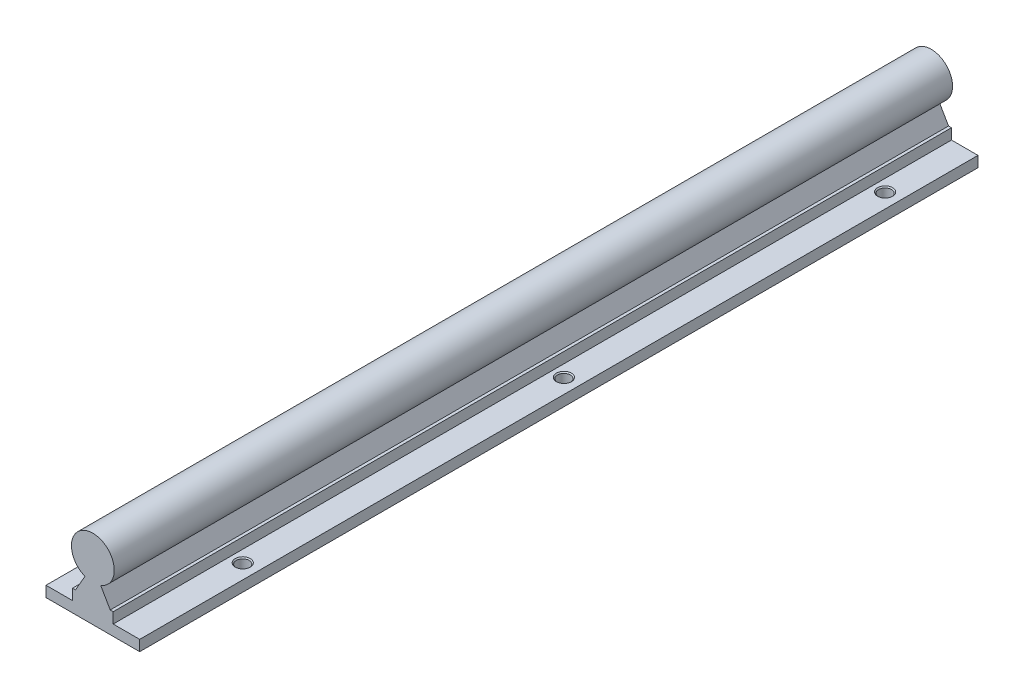
ISO-10303-21;
HEADER;
FILE_DESCRIPTION(('STEP AP214'),'2;1');
FILE_NAME('part.step','',(''),(''),'','','');
FILE_SCHEMA(('AUTOMOTIVE_DESIGN { 1 0 10303 214 1 1 1 1 }'));
ENDSEC;
DATA;
#1=APPLICATION_CONTEXT('core data for automotive mechanical design processes');
#2=APPLICATION_PROTOCOL_DEFINITION('international standard','automotive_design',2000,#1);
#3=PRODUCT_CONTEXT('',#1,'mechanical');
#4=PRODUCT('Part','Part','',(#3));
#5=PRODUCT_RELATED_PRODUCT_CATEGORY('part','',(#4));
#6=PRODUCT_DEFINITION_FORMATION('','',#4);
#7=PRODUCT_DEFINITION_CONTEXT('part definition',#1,'design');
#8=PRODUCT_DEFINITION('design','',#6,#7);
#9=PRODUCT_DEFINITION_SHAPE('','',#8);
#10=(LENGTH_UNIT() NAMED_UNIT(*) SI_UNIT(.MILLI.,.METRE.));
#11=(NAMED_UNIT(*) PLANE_ANGLE_UNIT() SI_UNIT($,.RADIAN.));
#12=(NAMED_UNIT(*) SI_UNIT($,.STERADIAN.) SOLID_ANGLE_UNIT());
#13=UNCERTAINTY_MEASURE_WITH_UNIT(LENGTH_MEASURE(1.E-05),#10,'distance_accuracy_value','');
#14=(GEOMETRIC_REPRESENTATION_CONTEXT(3) GLOBAL_UNCERTAINTY_ASSIGNED_CONTEXT((#13)) GLOBAL_UNIT_ASSIGNED_CONTEXT((#10,
#11,#12)) REPRESENTATION_CONTEXT('',''));
#15=CARTESIAN_POINT('',(0.,0.,0.));
#16=DIRECTION('',(0.,0.,1.));
#17=DIRECTION('',(1.,0.,0.));
#18=AXIS2_PLACEMENT_3D('',#15,#16,#17);
#19=CARTESIAN_POINT('',(-8.12119226265795,10.,205.));
#20=DIRECTION('',(0.,-1.,0.));
#21=DIRECTION('',(0.,0.,-1.));
#22=AXIS2_PLACEMENT_3D('',#19,#20,#21);
#23=PLANE('',#22);
#24=DIRECTION('',(0.,0.,-1.));
#25=VECTOR('',#24,1.);
#26=CARTESIAN_POINT('',(-8.12119226265795,10.,205.));
#27=LINE('',#26,#25);
#28=CARTESIAN_POINT('',(-8.12119226265795,10.,205.));
#29=VERTEX_POINT('',#28);
#30=CARTESIAN_POINT('',(-8.12119226265795,10.,-186.5));
#31=VERTEX_POINT('',#30);
#32=EDGE_CURVE('E316',#29,#31,#27,.T.);
#33=ORIENTED_EDGE('',*,*,#32,.T.);
#34=DIRECTION('',(-1.,0.,0.));
#35=VECTOR('',#34,1.);
#36=CARTESIAN_POINT('',(-8.12119226265795,10.,-186.5));
#37=LINE('',#36,#35);
#38=CARTESIAN_POINT('',(-9.5,10.,-186.5));
#39=VERTEX_POINT('',#38);
#40=EDGE_CURVE('E56',#31,#39,#37,.T.);
#41=ORIENTED_EDGE('',*,*,#40,.T.);
#42=DIRECTION('',(0.,0.,-1.));
#43=VECTOR('',#42,1.);
#44=CARTESIAN_POINT('',(-9.5,10.,205.));
#45=LINE('',#44,#43);
#46=CARTESIAN_POINT('',(-9.5,10.,205.));
#47=VERTEX_POINT('',#46);
#48=EDGE_CURVE('E167',#47,#39,#45,.T.);
#49=ORIENTED_EDGE('',*,*,#48,.F.);
#50=DIRECTION('',(-1.,0.,0.));
#51=VECTOR('',#50,1.);
#52=CARTESIAN_POINT('',(-8.12119226265795,10.,205.));
#53=LINE('',#52,#51);
#54=EDGE_CURVE('E293',#29,#47,#53,.T.);
#55=ORIENTED_EDGE('',*,*,#54,.F.);
#56=EDGE_LOOP('',(#33,#41,#49,#55));
#57=FACE_BOUND('',#56,.T.);
#58=ADVANCED_FACE('F40',(#57),#23,.F.);
#59=CARTESIAN_POINT('',(-9.5,10.,205.));
#60=DIRECTION('',(1.,0.,0.));
#61=DIRECTION('',(0.,1.,0.));
#62=AXIS2_PLACEMENT_3D('',#59,#60,#61);
#63=PLANE('',#62);
#64=ORIENTED_EDGE('',*,*,#48,.T.);
#65=DIRECTION('',(0.,-1.,0.));
#66=VECTOR('',#65,1.);
#67=CARTESIAN_POINT('',(-9.5,10.,-186.5));
#68=LINE('',#67,#66);
#69=CARTESIAN_POINT('',(-9.5,5.,-186.5));
#70=VERTEX_POINT('',#69);
#71=EDGE_CURVE('E340',#39,#70,#68,.T.);
#72=ORIENTED_EDGE('',*,*,#71,.T.);
#73=DIRECTION('',(0.,0.,-1.));
#74=VECTOR('',#73,1.);
#75=CARTESIAN_POINT('',(-9.5,5.,205.));
#76=LINE('',#75,#74);
#77=CARTESIAN_POINT('',(-9.5,5.,205.));
#78=VERTEX_POINT('',#77);
#79=EDGE_CURVE('E164',#78,#70,#76,.T.);
#80=ORIENTED_EDGE('',*,*,#79,.F.);
#81=DIRECTION('',(0.,-1.,0.));
#82=VECTOR('',#81,1.);
#83=CARTESIAN_POINT('',(-9.5,10.,205.));
#84=LINE('',#83,#82);
#85=EDGE_CURVE('E296',#47,#78,#84,.T.);
#86=ORIENTED_EDGE('',*,*,#85,.F.);
#87=EDGE_LOOP('',(#64,#72,#80,#86));
#88=FACE_BOUND('',#87,.T.);
#89=ADVANCED_FACE('F220',(#88),#63,.F.);
#90=CARTESIAN_POINT('',(-9.5,5.,205.));
#91=DIRECTION('',(0.,-1.,0.));
#92=DIRECTION('',(1.,0.,0.));
#93=AXIS2_PLACEMENT_3D('',#90,#91,#92);
#94=PLANE('',#93);
#95=CARTESIAN_POINT('',(-15.,5.,150.));
#96=DIRECTION('',(0.,-1.,0.));
#97=DIRECTION('',(1.,0.,0.));
#98=AXIS2_PLACEMENT_3D('',#95,#96,#97);
#99=CIRCLE('',#98,3.50000000000056);
#100=CARTESIAN_POINT('',(-11.4999999999994,5.,150.));
#101=VERTEX_POINT('',#100);
#102=EDGE_CURVE('E179',#101,#101,#99,.T.);
#103=ORIENTED_EDGE('',*,*,#102,.T.);
#104=EDGE_LOOP('',(#103));
#105=FACE_BOUND('',#104,.T.);
#106=CARTESIAN_POINT('',(-15.,5.,0.));
#107=DIRECTION('',(0.,-1.,0.));
#108=DIRECTION('',(1.,0.,0.));
#109=AXIS2_PLACEMENT_3D('',#106,#107,#108);
#110=CIRCLE('',#109,3.50000000000056);
#111=CARTESIAN_POINT('',(-11.4999999999994,5.,0.));
#112=VERTEX_POINT('',#111);
#113=EDGE_CURVE('E176',#112,#112,#110,.T.);
#114=ORIENTED_EDGE('',*,*,#113,.T.);
#115=EDGE_LOOP('',(#114));
#116=FACE_BOUND('',#115,.T.);
#117=CARTESIAN_POINT('',(-15.,5.,-150.));
#118=DIRECTION('',(0.,-1.,0.));
#119=DIRECTION('',(1.,0.,0.));
#120=AXIS2_PLACEMENT_3D('',#117,#118,#119);
#121=CIRCLE('',#120,3.50000000000001);
#122=CARTESIAN_POINT('',(-11.4999999999999,5.,-150.));
#123=VERTEX_POINT('',#122);
#124=EDGE_CURVE('E173',#123,#123,#121,.T.);
#125=ORIENTED_EDGE('',*,*,#124,.T.);
#126=EDGE_LOOP('',(#125));
#127=FACE_BOUND('',#126,.T.);
#128=ORIENTED_EDGE('',*,*,#79,.T.);
#129=DIRECTION('',(-1.,0.,0.));
#130=VECTOR('',#129,1.);
#131=CARTESIAN_POINT('',(-9.5,5.,-186.5));
#132=LINE('',#131,#130);
#133=CARTESIAN_POINT('',(-21.88,5.,-186.5));
#134=VERTEX_POINT('',#133);
#135=EDGE_CURVE('E286',#70,#134,#132,.T.);
#136=ORIENTED_EDGE('',*,*,#135,.T.);
#137=DIRECTION('',(0.,0.,-1.));
#138=VECTOR('',#137,1.);
#139=CARTESIAN_POINT('',(-21.88,5.,205.));
#140=LINE('',#139,#138);
#141=CARTESIAN_POINT('',(-21.88,5.,205.));
#142=VERTEX_POINT('',#141);
#143=EDGE_CURVE('E156',#142,#134,#140,.T.);
#144=ORIENTED_EDGE('',*,*,#143,.F.);
#145=DIRECTION('',(-1.,0.,0.));
#146=VECTOR('',#145,1.);
#147=CARTESIAN_POINT('',(-9.5,5.,205.));
#148=LINE('',#147,#146);
#149=EDGE_CURVE('E298',#78,#142,#148,.T.);
#150=ORIENTED_EDGE('',*,*,#149,.F.);
#151=EDGE_LOOP('',(#128,#136,#144,#150));
#152=FACE_BOUND('',#151,.T.);
#153=ADVANCED_FACE('F226',(#105,#116,#127,#152),#94,.F.);
#154=CARTESIAN_POINT('',(-21.88,5.,205.));
#155=DIRECTION('',(1.,0.,0.));
#156=DIRECTION('',(0.,0.,-1.));
#157=AXIS2_PLACEMENT_3D('',#154,#155,#156);
#158=PLANE('',#157);
#159=ORIENTED_EDGE('',*,*,#143,.T.);
#160=DIRECTION('',(0.,-1.,0.));
#161=VECTOR('',#160,1.);
#162=CARTESIAN_POINT('',(-21.88,37.,-186.5));
#163=LINE('',#162,#161);
#164=CARTESIAN_POINT('',(-21.88,0.,-186.5));
#165=VERTEX_POINT('',#164);
#166=EDGE_CURVE('E140',#134,#165,#163,.T.);
#167=ORIENTED_EDGE('',*,*,#166,.T.);
#168=DIRECTION('',(0.,0.,-1.));
#169=VECTOR('',#168,1.);
#170=CARTESIAN_POINT('',(-21.88,0.,205.));
#171=LINE('',#170,#169);
#172=CARTESIAN_POINT('',(-21.88,0.,205.));
#173=VERTEX_POINT('',#172);
#174=EDGE_CURVE('E150',#173,#165,#171,.T.);
#175=ORIENTED_EDGE('',*,*,#174,.F.);
#176=DIRECTION('',(0.,-1.,0.));
#177=VECTOR('',#176,1.);
#178=CARTESIAN_POINT('',(-21.88,5.,205.));
#179=LINE('',#178,#177);
#180=EDGE_CURVE('E300',#142,#173,#179,.T.);
#181=ORIENTED_EDGE('',*,*,#180,.F.);
#182=EDGE_LOOP('',(#159,#167,#175,#181));
#183=FACE_BOUND('',#182,.T.);
#184=ADVANCED_FACE('F358',(#183),#158,.F.);
#185=CARTESIAN_POINT('',(-21.88,0.,205.));
#186=DIRECTION('',(0.,1.,0.));
#187=DIRECTION('',(0.,0.,1.));
#188=AXIS2_PLACEMENT_3D('',#185,#186,#187);
#189=PLANE('',#188);
#190=CARTESIAN_POINT('',(-15.,0.,150.));
#191=DIRECTION('',(0.,-1.,0.));
#192=DIRECTION('',(0.,0.,-1.));
#193=AXIS2_PLACEMENT_3D('',#190,#191,#192);
#194=CIRCLE('',#193,3.00000000000053);
#195=CARTESIAN_POINT('',(-15.,0.,146.999999999999));
#196=VERTEX_POINT('',#195);
#197=EDGE_CURVE('E294',#196,#196,#194,.T.);
#198=ORIENTED_EDGE('',*,*,#197,.F.);
#199=EDGE_LOOP('',(#198));
#200=FACE_BOUND('',#199,.T.);
#201=CARTESIAN_POINT('',(-15.,0.,0.));
#202=DIRECTION('',(0.,-1.,0.));
#203=DIRECTION('',(0.,0.,-1.));
#204=AXIS2_PLACEMENT_3D('',#201,#202,#203);
#205=CIRCLE('',#204,3.00000000000053);
#206=CARTESIAN_POINT('',(-15.,0.,-3.00000000000053));
#207=VERTEX_POINT('',#206);
#208=EDGE_CURVE('E283',#207,#207,#205,.T.);
#209=ORIENTED_EDGE('',*,*,#208,.F.);
#210=EDGE_LOOP('',(#209));
#211=FACE_BOUND('',#210,.T.);
#212=CARTESIAN_POINT('',(15.,0.,0.));
#213=DIRECTION('',(0.,-1.,0.));
#214=DIRECTION('',(0.,0.,-1.));
#215=AXIS2_PLACEMENT_3D('',#212,#213,#214);
#216=CIRCLE('',#215,2.99999999999948);
#217=CARTESIAN_POINT('',(15.,0.,-2.99999999999948));
#218=VERTEX_POINT('',#217);
#219=EDGE_CURVE('E279',#218,#218,#216,.T.);
#220=ORIENTED_EDGE('',*,*,#219,.F.);
#221=EDGE_LOOP('',(#220));
#222=FACE_BOUND('',#221,.T.);
#223=CARTESIAN_POINT('',(15.,0.,-150.));
#224=DIRECTION('',(0.,-1.,0.));
#225=DIRECTION('',(0.,0.,-1.));
#226=AXIS2_PLACEMENT_3D('',#223,#224,#225);
#227=CIRCLE('',#226,3.00000000000001);
#228=CARTESIAN_POINT('',(15.,0.,-153.));
#229=VERTEX_POINT('',#228);
#230=EDGE_CURVE('E277',#229,#229,#227,.T.);
#231=ORIENTED_EDGE('',*,*,#230,.F.);
#232=EDGE_LOOP('',(#231));
#233=FACE_BOUND('',#232,.T.);
#234=CARTESIAN_POINT('',(-15.,0.,-150.));
#235=DIRECTION('',(0.,-1.,0.));
#236=DIRECTION('',(0.,0.,-1.));
#237=AXIS2_PLACEMENT_3D('',#234,#235,#236);
#238=CIRCLE('',#237,3.00000000000001);
#239=CARTESIAN_POINT('',(-15.,0.,-153.));
#240=VERTEX_POINT('',#239);
#241=EDGE_CURVE('E280',#240,#240,#238,.T.);
#242=ORIENTED_EDGE('',*,*,#241,.F.);
#243=EDGE_LOOP('',(#242));
#244=FACE_BOUND('',#243,.T.);
#245=CARTESIAN_POINT('',(15.,0.,150.));
#246=DIRECTION('',(0.,-1.,0.));
#247=DIRECTION('',(0.,0.,-1.));
#248=AXIS2_PLACEMENT_3D('',#245,#246,#247);
#249=CIRCLE('',#248,2.99999999999947);
#250=CARTESIAN_POINT('',(15.,0.,147.000000000001));
#251=VERTEX_POINT('',#250);
#252=EDGE_CURVE('E290',#251,#251,#249,.T.);
#253=ORIENTED_EDGE('',*,*,#252,.F.);
#254=EDGE_LOOP('',(#253));
#255=FACE_BOUND('',#254,.T.);
#256=ORIENTED_EDGE('',*,*,#174,.T.);
#257=DIRECTION('',(-1.,0.,0.));
#258=VECTOR('',#257,1.);
#259=CARTESIAN_POINT('',(-21.88,0.,-186.5));
#260=LINE('',#259,#258);
#261=CARTESIAN_POINT('',(21.88,0.,-186.5));
#262=VERTEX_POINT('',#261);
#263=EDGE_CURVE('E132',#262,#165,#260,.T.);
#264=ORIENTED_EDGE('',*,*,#263,.F.);
#265=DIRECTION('',(0.,0.,-1.));
#266=VECTOR('',#265,1.);
#267=CARTESIAN_POINT('',(21.88,0.,205.));
#268=LINE('',#267,#266);
#269=CARTESIAN_POINT('',(21.88,0.,205.));
#270=VERTEX_POINT('',#269);
#271=EDGE_CURVE('E147',#270,#262,#268,.T.);
#272=ORIENTED_EDGE('',*,*,#271,.F.);
#273=DIRECTION('',(1.,0.,0.));
#274=VECTOR('',#273,1.);
#275=CARTESIAN_POINT('',(-21.88,0.,205.));
#276=LINE('',#275,#274);
#277=EDGE_CURVE('E302',#173,#270,#276,.T.);
#278=ORIENTED_EDGE('',*,*,#277,.F.);
#279=EDGE_LOOP('',(#256,#264,#272,#278));
#280=FACE_BOUND('',#279,.T.);
#281=ADVANCED_FACE('F145',(#200,#211,#222,#233,#244,#255,#280),#189,.F.);
#282=CARTESIAN_POINT('',(21.88,5.,205.));
#283=DIRECTION('',(-1.,0.,0.));
#284=DIRECTION('',(0.,0.,1.));
#285=AXIS2_PLACEMENT_3D('',#282,#283,#284);
#286=PLANE('',#285);
#287=ORIENTED_EDGE('',*,*,#271,.T.);
#288=DIRECTION('',(0.,-1.,0.));
#289=VECTOR('',#288,1.);
#290=CARTESIAN_POINT('',(21.88,37.,-186.5));
#291=LINE('',#290,#289);
#292=CARTESIAN_POINT('',(21.88,5.,-186.5));
#293=VERTEX_POINT('',#292);
#294=EDGE_CURVE('E129',#293,#262,#291,.T.);
#295=ORIENTED_EDGE('',*,*,#294,.F.);
#296=DIRECTION('',(0.,0.,-1.));
#297=VECTOR('',#296,1.);
#298=CARTESIAN_POINT('',(21.88,5.,205.));
#299=LINE('',#298,#297);
#300=CARTESIAN_POINT('',(21.88,5.,205.));
#301=VERTEX_POINT('',#300);
#302=EDGE_CURVE('E154',#301,#293,#299,.T.);
#303=ORIENTED_EDGE('',*,*,#302,.F.);
#304=DIRECTION('',(0.,1.,0.));
#305=VECTOR('',#304,1.);
#306=CARTESIAN_POINT('',(21.88,5.,205.));
#307=LINE('',#306,#305);
#308=EDGE_CURVE('E153',#270,#301,#307,.T.);
#309=ORIENTED_EDGE('',*,*,#308,.F.);
#310=EDGE_LOOP('',(#287,#295,#303,#309));
#311=FACE_BOUND('',#310,.T.);
#312=ADVANCED_FACE('F152',(#311),#286,.F.);
#313=CARTESIAN_POINT('',(9.5,5.,205.));
#314=DIRECTION('',(0.,-1.,0.));
#315=DIRECTION('',(1.,0.,0.));
#316=AXIS2_PLACEMENT_3D('',#313,#314,#315);
#317=PLANE('',#316);
#318=CARTESIAN_POINT('',(15.,5.,-150.));
#319=DIRECTION('',(0.,-1.,0.));
#320=DIRECTION('',(1.,0.,0.));
#321=AXIS2_PLACEMENT_3D('',#318,#319,#320);
#322=CIRCLE('',#321,3.5);
#323=CARTESIAN_POINT('',(18.5,5.,-150.));
#324=VERTEX_POINT('',#323);
#325=EDGE_CURVE('E197',#324,#324,#322,.T.);
#326=ORIENTED_EDGE('',*,*,#325,.T.);
#327=EDGE_LOOP('',(#326));
#328=FACE_BOUND('',#327,.T.);
#329=CARTESIAN_POINT('',(15.,5.,0.));
#330=DIRECTION('',(0.,-1.,0.));
#331=DIRECTION('',(1.,0.,0.));
#332=AXIS2_PLACEMENT_3D('',#329,#330,#331);
#333=CIRCLE('',#332,3.49999999999945);
#334=CARTESIAN_POINT('',(18.4999999999995,5.,0.));
#335=VERTEX_POINT('',#334);
#336=EDGE_CURVE('E194',#335,#335,#333,.T.);
#337=ORIENTED_EDGE('',*,*,#336,.T.);
#338=EDGE_LOOP('',(#337));
#339=FACE_BOUND('',#338,.T.);
#340=CARTESIAN_POINT('',(15.,5.,150.));
#341=DIRECTION('',(0.,-1.,0.));
#342=DIRECTION('',(1.,0.,0.));
#343=AXIS2_PLACEMENT_3D('',#340,#341,#342);
#344=CIRCLE('',#343,3.49999999999945);
#345=CARTESIAN_POINT('',(18.4999999999994,5.,150.));
#346=VERTEX_POINT('',#345);
#347=EDGE_CURVE('E191',#346,#346,#344,.T.);
#348=ORIENTED_EDGE('',*,*,#347,.T.);
#349=EDGE_LOOP('',(#348));
#350=FACE_BOUND('',#349,.T.);
#351=ORIENTED_EDGE('',*,*,#302,.T.);
#352=DIRECTION('',(-1.,0.,0.));
#353=VECTOR('',#352,1.);
#354=CARTESIAN_POINT('',(9.5,5.,-186.5));
#355=LINE('',#354,#353);
#356=CARTESIAN_POINT('',(9.5,5.,-186.5));
#357=VERTEX_POINT('',#356);
#358=EDGE_CURVE('E135',#293,#357,#355,.T.);
#359=ORIENTED_EDGE('',*,*,#358,.T.);
#360=DIRECTION('',(0.,0.,-1.));
#361=VECTOR('',#360,1.);
#362=CARTESIAN_POINT('',(9.5,5.,205.));
#363=LINE('',#362,#361);
#364=CARTESIAN_POINT('',(9.5,5.,205.));
#365=VERTEX_POINT('',#364);
#366=EDGE_CURVE('E158',#365,#357,#363,.T.);
#367=ORIENTED_EDGE('',*,*,#366,.F.);
#368=DIRECTION('',(-1.,0.,0.));
#369=VECTOR('',#368,1.);
#370=CARTESIAN_POINT('',(9.5,5.,205.));
#371=LINE('',#370,#369);
#372=EDGE_CURVE('E305',#301,#365,#371,.T.);
#373=ORIENTED_EDGE('',*,*,#372,.F.);
#374=EDGE_LOOP('',(#351,#359,#367,#373));
#375=FACE_BOUND('',#374,.T.);
#376=ADVANCED_FACE('F339',(#328,#339,#350,#375),#317,.F.);
#377=CARTESIAN_POINT('',(9.5,10.,205.));
#378=DIRECTION('',(-1.,0.,0.));
#379=DIRECTION('',(0.,-1.,0.));
#380=AXIS2_PLACEMENT_3D('',#377,#378,#379);
#381=PLANE('',#380);
#382=ORIENTED_EDGE('',*,*,#366,.T.);
#383=DIRECTION('',(0.,1.,0.));
#384=VECTOR('',#383,1.);
#385=CARTESIAN_POINT('',(9.5,10.,-186.5));
#386=LINE('',#385,#384);
#387=CARTESIAN_POINT('',(9.5,10.,-186.5));
#388=VERTEX_POINT('',#387);
#389=EDGE_CURVE('E336',#357,#388,#386,.T.);
#390=ORIENTED_EDGE('',*,*,#389,.T.);
#391=DIRECTION('',(0.,0.,-1.));
#392=VECTOR('',#391,1.);
#393=CARTESIAN_POINT('',(9.5,10.,205.));
#394=LINE('',#393,#392);
#395=CARTESIAN_POINT('',(9.5,10.,205.));
#396=VERTEX_POINT('',#395);
#397=EDGE_CURVE('E327',#396,#388,#394,.T.);
#398=ORIENTED_EDGE('',*,*,#397,.F.);
#399=DIRECTION('',(0.,1.,0.));
#400=VECTOR('',#399,1.);
#401=CARTESIAN_POINT('',(9.5,10.,205.));
#402=LINE('',#401,#400);
#403=EDGE_CURVE('E307',#365,#396,#402,.T.);
#404=ORIENTED_EDGE('',*,*,#403,.F.);
#405=EDGE_LOOP('',(#382,#390,#398,#404));
#406=FACE_BOUND('',#405,.T.);
#407=ADVANCED_FACE('F334',(#406),#381,.F.);
#408=CARTESIAN_POINT('',(8.12119226265795,10.,205.));
#409=DIRECTION('',(0.,-1.,0.));
#410=DIRECTION('',(0.,0.,-1.));
#411=AXIS2_PLACEMENT_3D('',#408,#409,#410);
#412=PLANE('',#411);
#413=ORIENTED_EDGE('',*,*,#397,.T.);
#414=DIRECTION('',(-1.,0.,0.));
#415=VECTOR('',#414,1.);
#416=CARTESIAN_POINT('',(8.12119226265795,10.,-186.5));
#417=LINE('',#416,#415);
#418=CARTESIAN_POINT('',(8.12119226265795,10.,-186.5));
#419=VERTEX_POINT('',#418);
#420=EDGE_CURVE('E344',#388,#419,#417,.T.);
#421=ORIENTED_EDGE('',*,*,#420,.T.);
#422=DIRECTION('',(0.,0.,-1.));
#423=VECTOR('',#422,1.);
#424=CARTESIAN_POINT('',(8.12119226265795,10.,205.));
#425=LINE('',#424,#423);
#426=CARTESIAN_POINT('',(8.12119226265795,10.,205.));
#427=VERTEX_POINT('',#426);
#428=EDGE_CURVE('E324',#427,#419,#425,.T.);
#429=ORIENTED_EDGE('',*,*,#428,.F.);
#430=DIRECTION('',(-1.,0.,0.));
#431=VECTOR('',#430,1.);
#432=CARTESIAN_POINT('',(8.12119226265795,10.,205.));
#433=LINE('',#432,#431);
#434=EDGE_CURVE('E309',#396,#427,#433,.T.);
#435=ORIENTED_EDGE('',*,*,#434,.F.);
#436=EDGE_LOOP('',(#413,#421,#429,#435));
#437=FACE_BOUND('',#436,.T.);
#438=ADVANCED_FACE('F386',(#437),#412,.F.);
#439=CARTESIAN_POINT('',(8.12119226265795,10.,205.));
#440=DIRECTION('',(-0.866025403784438,-0.500000000000001,0.));
#441=DIRECTION('',(0.500000000000001,-0.866025403784438,0.));
#442=AXIS2_PLACEMENT_3D('',#439,#440,#441);
#443=PLANE('',#442);
#444=ORIENTED_EDGE('',*,*,#428,.T.);
#445=DIRECTION('',(-0.500000000000001,0.866025403784438,0.));
#446=VECTOR('',#445,1.);
#447=CARTESIAN_POINT('',(8.12119226265795,10.,-186.5));
#448=LINE('',#447,#446);
#449=CARTESIAN_POINT('',(3.67559518989782,17.7,-186.5));
#450=VERTEX_POINT('',#449);
#451=EDGE_CURVE('E417',#419,#450,#448,.T.);
#452=ORIENTED_EDGE('',*,*,#451,.T.);
#453=DIRECTION('',(0.,0.,-1.));
#454=VECTOR('',#453,1.);
#455=CARTESIAN_POINT('',(3.67559518989782,17.7,205.));
#456=LINE('',#455,#454);
#457=CARTESIAN_POINT('',(3.67559518989782,17.7,205.));
#458=VERTEX_POINT('',#457);
#459=EDGE_CURVE('E321',#458,#450,#456,.T.);
#460=ORIENTED_EDGE('',*,*,#459,.F.);
#461=DIRECTION('',(-0.500000000000001,0.866025403784438,0.));
#462=VECTOR('',#461,1.);
#463=CARTESIAN_POINT('',(8.12119226265795,10.,205.));
#464=LINE('',#463,#462);
#465=EDGE_CURVE('E311',#427,#458,#464,.T.);
#466=ORIENTED_EDGE('',*,*,#465,.F.);
#467=EDGE_LOOP('',(#444,#452,#460,#466));
#468=FACE_BOUND('',#467,.T.);
#469=ADVANCED_FACE('F382',(#468),#443,.F.);
#470=CARTESIAN_POINT('',(0.,27.,205.));
#471=DIRECTION('',(0.,0.,-1.));
#472=DIRECTION('',(-1.,0.,0.));
#473=AXIS2_PLACEMENT_3D('',#470,#471,#472);
#474=CYLINDRICAL_SURFACE('',#473,10.);
#475=CARTESIAN_POINT('',(0.,27.,-186.5));
#476=DIRECTION('',(0.,0.,1.));
#477=DIRECTION('',(1.,0.,0.));
#478=AXIS2_PLACEMENT_3D('',#475,#476,#477);
#479=CIRCLE('',#478,10.);
#480=CARTESIAN_POINT('',(-3.67559518989782,17.7,-186.5));
#481=VERTEX_POINT('',#480);
#482=EDGE_CURVE('E415',#450,#481,#479,.T.);
#483=ORIENTED_EDGE('',*,*,#482,.T.);
#484=DIRECTION('',(0.,0.,-1.));
#485=VECTOR('',#484,1.);
#486=CARTESIAN_POINT('',(-3.67559518989782,17.7,205.));
#487=LINE('',#486,#485);
#488=CARTESIAN_POINT('',(-3.67559518989782,17.7,205.));
#489=VERTEX_POINT('',#488);
#490=EDGE_CURVE('E318',#489,#481,#487,.T.);
#491=ORIENTED_EDGE('',*,*,#490,.F.);
#492=CARTESIAN_POINT('',(0.,27.,205.));
#493=DIRECTION('',(0.,0.,1.));
#494=DIRECTION('',(1.,0.,0.));
#495=AXIS2_PLACEMENT_3D('',#492,#493,#494);
#496=CIRCLE('',#495,10.);
#497=EDGE_CURVE('E313',#458,#489,#496,.T.);
#498=ORIENTED_EDGE('',*,*,#497,.F.);
#499=ORIENTED_EDGE('',*,*,#459,.T.);
#500=EDGE_LOOP('',(#483,#491,#498,#499));
#501=FACE_BOUND('',#500,.T.);
#502=ADVANCED_FACE('F378',(#501),#474,.T.);
#503=CARTESIAN_POINT('',(-8.12119226265795,10.,205.));
#504=DIRECTION('',(0.866025403784438,-0.500000000000001,0.));
#505=DIRECTION('',(0.500000000000001,0.866025403784438,0.));
#506=AXIS2_PLACEMENT_3D('',#503,#504,#505);
#507=PLANE('',#506);
#508=ORIENTED_EDGE('',*,*,#490,.T.);
#509=DIRECTION('',(-0.500000000000001,-0.866025403784438,0.));
#510=VECTOR('',#509,1.);
#511=CARTESIAN_POINT('',(-8.12119226265795,10.,-186.5));
#512=LINE('',#511,#510);
#513=EDGE_CURVE('E11',#481,#31,#512,.T.);
#514=ORIENTED_EDGE('',*,*,#513,.T.);
#515=ORIENTED_EDGE('',*,*,#32,.F.);
#516=DIRECTION('',(-0.500000000000001,-0.866025403784438,0.));
#517=VECTOR('',#516,1.);
#518=CARTESIAN_POINT('',(-8.12119226265795,10.,205.));
#519=LINE('',#518,#517);
#520=EDGE_CURVE('E63',#489,#29,#519,.T.);
#521=ORIENTED_EDGE('',*,*,#520,.F.);
#522=EDGE_LOOP('',(#508,#514,#515,#521));
#523=FACE_BOUND('',#522,.T.);
#524=ADVANCED_FACE('F372',(#523),#507,.F.);
#525=CARTESIAN_POINT('',(0.,27.,205.));
#526=DIRECTION('',(0.,0.,1.));
#527=DIRECTION('',(1.,0.,0.));
#528=AXIS2_PLACEMENT_3D('',#525,#526,#527);
#529=PLANE('',#528);
#530=ORIENTED_EDGE('',*,*,#54,.T.);
#531=ORIENTED_EDGE('',*,*,#85,.T.);
#532=ORIENTED_EDGE('',*,*,#149,.T.);
#533=ORIENTED_EDGE('',*,*,#180,.T.);
#534=ORIENTED_EDGE('',*,*,#277,.T.);
#535=ORIENTED_EDGE('',*,*,#308,.T.);
#536=ORIENTED_EDGE('',*,*,#372,.T.);
#537=ORIENTED_EDGE('',*,*,#403,.T.);
#538=ORIENTED_EDGE('',*,*,#434,.T.);
#539=ORIENTED_EDGE('',*,*,#465,.T.);
#540=ORIENTED_EDGE('',*,*,#497,.T.);
#541=ORIENTED_EDGE('',*,*,#520,.T.);
#542=EDGE_LOOP('',(#530,#531,#532,#533,#534,#535,#536,#537,#538,#539,#540,#541));
#543=FACE_BOUND('',#542,.T.);
#544=ADVANCED_FACE('F367',(#543),#529,.T.);
#545=CARTESIAN_POINT('',(15.,37.001,150.));
#546=DIRECTION('',(0.,-1.,0.));
#547=DIRECTION('',(0.,0.,-1.));
#548=AXIS2_PLACEMENT_3D('',#545,#546,#547);
#549=CYLINDRICAL_SURFACE('',#548,2.99999999999947);
#550=CARTESIAN_POINT('',(15.,4.50000000000001,150.));
#551=DIRECTION('',(0.,-1.,0.));
#552=DIRECTION('',(0.,0.,-1.));
#553=AXIS2_PLACEMENT_3D('',#550,#551,#552);
#554=CIRCLE('',#553,2.99999999999947);
#555=CARTESIAN_POINT('',(15.,4.50000000000001,147.000000000001));
#556=VERTEX_POINT('',#555);
#557=EDGE_CURVE('E49',#556,#556,#554,.F.);
#558=ORIENTED_EDGE('',*,*,#557,.T.);
#559=EDGE_LOOP('',(#558));
#560=FACE_BOUND('',#559,.T.);
#561=ORIENTED_EDGE('',*,*,#252,.T.);
#562=EDGE_LOOP('',(#561));
#563=FACE_BOUND('',#562,.T.);
#564=ADVANCED_FACE('F205',(#560,#563),#549,.F.);
#565=CARTESIAN_POINT('',(15.,37.001,-150.));
#566=DIRECTION('',(0.,-1.,0.));
#567=DIRECTION('',(0.,0.,-1.));
#568=AXIS2_PLACEMENT_3D('',#565,#566,#567);
#569=CYLINDRICAL_SURFACE('',#568,3.00000000000001);
#570=CARTESIAN_POINT('',(15.,4.50000000000005,-150.));
#571=DIRECTION('',(0.,-1.,0.));
#572=DIRECTION('',(0.,0.,-1.));
#573=AXIS2_PLACEMENT_3D('',#570,#571,#572);
#574=CIRCLE('',#573,3.00000000000001);
#575=CARTESIAN_POINT('',(15.,4.50000000000005,-153.));
#576=VERTEX_POINT('',#575);
#577=EDGE_CURVE('E188',#576,#576,#574,.F.);
#578=ORIENTED_EDGE('',*,*,#577,.T.);
#579=EDGE_LOOP('',(#578));
#580=FACE_BOUND('',#579,.T.);
#581=ORIENTED_EDGE('',*,*,#230,.T.);
#582=EDGE_LOOP('',(#581));
#583=FACE_BOUND('',#582,.T.);
#584=ADVANCED_FACE('F270',(#580,#583),#569,.F.);
#585=CARTESIAN_POINT('',(15.,37.001,0.));
#586=DIRECTION('',(0.,-1.,0.));
#587=DIRECTION('',(0.,0.,-1.));
#588=AXIS2_PLACEMENT_3D('',#585,#586,#587);
#589=CYLINDRICAL_SURFACE('',#588,2.99999999999948);
#590=CARTESIAN_POINT('',(15.,4.50000000000002,0.));
#591=DIRECTION('',(0.,-1.,0.));
#592=DIRECTION('',(0.,0.,-1.));
#593=AXIS2_PLACEMENT_3D('',#590,#591,#592);
#594=CIRCLE('',#593,2.99999999999948);
#595=CARTESIAN_POINT('',(15.,4.50000000000002,-2.99999999999948));
#596=VERTEX_POINT('',#595);
#597=EDGE_CURVE('E200',#596,#596,#594,.F.);
#598=ORIENTED_EDGE('',*,*,#597,.T.);
#599=EDGE_LOOP('',(#598));
#600=FACE_BOUND('',#599,.T.);
#601=ORIENTED_EDGE('',*,*,#219,.T.);
#602=EDGE_LOOP('',(#601));
#603=FACE_BOUND('',#602,.T.);
#604=ADVANCED_FACE('F273',(#600,#603),#589,.F.);
#605=CARTESIAN_POINT('',(-15.,37.001,-150.));
#606=DIRECTION('',(0.,-1.,0.));
#607=DIRECTION('',(0.,0.,-1.));
#608=AXIS2_PLACEMENT_3D('',#605,#606,#607);
#609=CYLINDRICAL_SURFACE('',#608,3.00000000000001);
#610=CARTESIAN_POINT('',(-15.,4.50000000000005,-150.));
#611=DIRECTION('',(0.,-1.,0.));
#612=DIRECTION('',(0.,0.,-1.));
#613=AXIS2_PLACEMENT_3D('',#610,#611,#612);
#614=CIRCLE('',#613,3.00000000000001);
#615=CARTESIAN_POINT('',(-15.,4.50000000000005,-153.));
#616=VERTEX_POINT('',#615);
#617=EDGE_CURVE('E185',#616,#616,#614,.F.);
#618=ORIENTED_EDGE('',*,*,#617,.T.);
#619=EDGE_LOOP('',(#618));
#620=FACE_BOUND('',#619,.T.);
#621=ORIENTED_EDGE('',*,*,#241,.T.);
#622=EDGE_LOOP('',(#621));
#623=FACE_BOUND('',#622,.T.);
#624=ADVANCED_FACE('F433',(#620,#623),#609,.F.);
#625=CARTESIAN_POINT('',(-15.,37.001,0.));
#626=DIRECTION('',(0.,-1.,0.));
#627=DIRECTION('',(0.,0.,-1.));
#628=AXIS2_PLACEMENT_3D('',#625,#626,#627);
#629=CYLINDRICAL_SURFACE('',#628,3.00000000000053);
#630=CARTESIAN_POINT('',(-15.,4.50000000000001,0.));
#631=DIRECTION('',(0.,-1.,0.));
#632=DIRECTION('',(0.,0.,-1.));
#633=AXIS2_PLACEMENT_3D('',#630,#631,#632);
#634=CIRCLE('',#633,3.00000000000053);
#635=CARTESIAN_POINT('',(-15.,4.50000000000001,-3.00000000000053));
#636=VERTEX_POINT('',#635);
#637=EDGE_CURVE('E182',#636,#636,#634,.F.);
#638=ORIENTED_EDGE('',*,*,#637,.T.);
#639=EDGE_LOOP('',(#638));
#640=FACE_BOUND('',#639,.T.);
#641=ORIENTED_EDGE('',*,*,#208,.T.);
#642=EDGE_LOOP('',(#641));
#643=FACE_BOUND('',#642,.T.);
#644=ADVANCED_FACE('F354',(#640,#643),#629,.F.);
#645=CARTESIAN_POINT('',(-15.,37.001,150.));
#646=DIRECTION('',(0.,-1.,0.));
#647=DIRECTION('',(0.,0.,-1.));
#648=AXIS2_PLACEMENT_3D('',#645,#646,#647);
#649=CYLINDRICAL_SURFACE('',#648,3.00000000000053);
#650=CARTESIAN_POINT('',(-15.,4.50000000000001,150.));
#651=DIRECTION('',(0.,-1.,0.));
#652=DIRECTION('',(0.,0.,-1.));
#653=AXIS2_PLACEMENT_3D('',#650,#651,#652);
#654=CIRCLE('',#653,3.00000000000053);
#655=CARTESIAN_POINT('',(-15.,4.50000000000001,146.999999999999));
#656=VERTEX_POINT('',#655);
#657=EDGE_CURVE('E170',#656,#656,#654,.F.);
#658=ORIENTED_EDGE('',*,*,#657,.T.);
#659=EDGE_LOOP('',(#658));
#660=FACE_BOUND('',#659,.T.);
#661=ORIENTED_EDGE('',*,*,#197,.T.);
#662=EDGE_LOOP('',(#661));
#663=FACE_BOUND('',#662,.T.);
#664=ADVANCED_FACE('F240',(#660,#663),#649,.F.);
#665=CARTESIAN_POINT('',(-15.,4.50000000000001,150.));
#666=DIRECTION('',(0.,1.,0.));
#667=DIRECTION('',(0.,0.,1.));
#668=AXIS2_PLACEMENT_3D('',#665,#666,#667);
#669=CONICAL_SURFACE('',#668,3.00000000000053,0.785398163397493);
#670=ORIENTED_EDGE('',*,*,#102,.F.);
#671=EDGE_LOOP('',(#670));
#672=FACE_BOUND('',#671,.T.);
#673=ORIENTED_EDGE('',*,*,#657,.F.);
#674=EDGE_LOOP('',(#673));
#675=FACE_BOUND('',#674,.T.);
#676=ADVANCED_FACE('F233',(#672,#675),#669,.F.);
#677=CARTESIAN_POINT('',(-15.,4.50000000000001,0.));
#678=DIRECTION('',(0.,1.,0.));
#679=DIRECTION('',(0.,0.,1.));
#680=AXIS2_PLACEMENT_3D('',#677,#678,#679);
#681=CONICAL_SURFACE('',#680,3.00000000000053,0.785398163397493);
#682=ORIENTED_EDGE('',*,*,#113,.F.);
#683=EDGE_LOOP('',(#682));
#684=FACE_BOUND('',#683,.T.);
#685=ORIENTED_EDGE('',*,*,#637,.F.);
#686=EDGE_LOOP('',(#685));
#687=FACE_BOUND('',#686,.T.);
#688=ADVANCED_FACE('F239',(#684,#687),#681,.F.);
#689=CARTESIAN_POINT('',(-15.,4.50000000000005,-150.));
#690=DIRECTION('',(0.,1.,0.));
#691=DIRECTION('',(0.,0.,1.));
#692=AXIS2_PLACEMENT_3D('',#689,#690,#691);
#693=CONICAL_SURFACE('',#692,3.00000000000001,0.785398163397495);
#694=ORIENTED_EDGE('',*,*,#124,.F.);
#695=EDGE_LOOP('',(#694));
#696=FACE_BOUND('',#695,.T.);
#697=ORIENTED_EDGE('',*,*,#617,.F.);
#698=EDGE_LOOP('',(#697));
#699=FACE_BOUND('',#698,.T.);
#700=ADVANCED_FACE('F247',(#696,#699),#693,.F.);
#701=CARTESIAN_POINT('',(15.,4.50000000000005,-150.));
#702=DIRECTION('',(0.,1.,0.));
#703=DIRECTION('',(0.,0.,1.));
#704=AXIS2_PLACEMENT_3D('',#701,#702,#703);
#705=CONICAL_SURFACE('',#704,3.00000000000001,0.785398163397496);
#706=ORIENTED_EDGE('',*,*,#325,.F.);
#707=EDGE_LOOP('',(#706));
#708=FACE_BOUND('',#707,.T.);
#709=ORIENTED_EDGE('',*,*,#577,.F.);
#710=EDGE_LOOP('',(#709));
#711=FACE_BOUND('',#710,.T.);
#712=ADVANCED_FACE('F216',(#708,#711),#705,.F.);
#713=CARTESIAN_POINT('',(15.,4.50000000000002,0.));
#714=DIRECTION('',(0.,1.,0.));
#715=DIRECTION('',(0.,0.,1.));
#716=AXIS2_PLACEMENT_3D('',#713,#714,#715);
#717=CONICAL_SURFACE('',#716,2.99999999999948,0.785398163397441);
#718=ORIENTED_EDGE('',*,*,#336,.F.);
#719=EDGE_LOOP('',(#718));
#720=FACE_BOUND('',#719,.T.);
#721=ORIENTED_EDGE('',*,*,#597,.F.);
#722=EDGE_LOOP('',(#721));
#723=FACE_BOUND('',#722,.T.);
#724=ADVANCED_FACE('F209',(#720,#723),#717,.F.);
#725=CARTESIAN_POINT('',(15.,4.50000000000001,150.));
#726=DIRECTION('',(0.,1.,0.));
#727=DIRECTION('',(0.,0.,1.));
#728=AXIS2_PLACEMENT_3D('',#725,#726,#727);
#729=CONICAL_SURFACE('',#728,2.99999999999947,0.785398163397441);
#730=ORIENTED_EDGE('',*,*,#347,.F.);
#731=EDGE_LOOP('',(#730));
#732=FACE_BOUND('',#731,.T.);
#733=ORIENTED_EDGE('',*,*,#557,.F.);
#734=EDGE_LOOP('',(#733));
#735=FACE_BOUND('',#734,.T.);
#736=ADVANCED_FACE('F43',(#732,#735),#729,.F.);
#737=CARTESIAN_POINT('',(-21.88,37.,-186.5));
#738=DIRECTION('',(0.,0.,1.));
#739=DIRECTION('',(1.,0.,0.));
#740=AXIS2_PLACEMENT_3D('',#737,#738,#739);
#741=PLANE('',#740);
#742=ORIENTED_EDGE('',*,*,#71,.F.);
#743=ORIENTED_EDGE('',*,*,#40,.F.);
#744=ORIENTED_EDGE('',*,*,#513,.F.);
#745=ORIENTED_EDGE('',*,*,#482,.F.);
#746=ORIENTED_EDGE('',*,*,#451,.F.);
#747=ORIENTED_EDGE('',*,*,#420,.F.);
#748=ORIENTED_EDGE('',*,*,#389,.F.);
#749=ORIENTED_EDGE('',*,*,#358,.F.);
#750=ORIENTED_EDGE('',*,*,#294,.T.);
#751=ORIENTED_EDGE('',*,*,#263,.T.);
#752=ORIENTED_EDGE('',*,*,#166,.F.);
#753=ORIENTED_EDGE('',*,*,#135,.F.);
#754=EDGE_LOOP('',(#742,#743,#744,#745,#746,#747,#748,#749,#750,#751,#752,#753));
#755=FACE_BOUND('',#754,.T.);
#756=ADVANCED_FACE('F131',(#755),#741,.F.);
#757=CLOSED_SHELL('',(#58,#89,#153,#184,#281,#312,#376,#407,#438,#469,#502,#524,#544,#564,#584,
#604,#624,#644,#664,#676,#688,#700,#712,#724,#736,#756));
#758=MANIFOLD_SOLID_BREP('B2',#757);
#759=ADVANCED_BREP_SHAPE_REPRESENTATION('',(#18,#758),#14);
#760=SHAPE_DEFINITION_REPRESENTATION(#9,#759);
ENDSEC;
END-ISO-10303-21;
